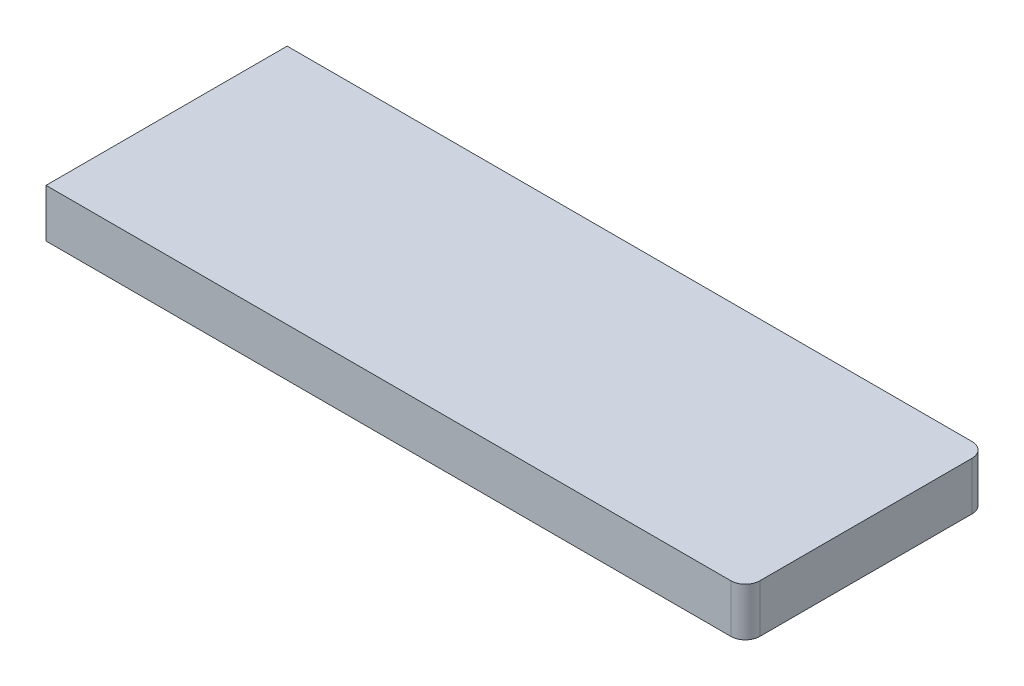
ISO-10303-21;
HEADER;
FILE_DESCRIPTION(('STEP AP214'),'2;1');
FILE_NAME('part.step','',(''),(''),'','','');
FILE_SCHEMA(('AUTOMOTIVE_DESIGN { 1 0 10303 214 1 1 1 1 }'));
ENDSEC;
DATA;
#1=APPLICATION_CONTEXT('core data for automotive mechanical design processes');
#2=APPLICATION_PROTOCOL_DEFINITION('international standard','automotive_design',2000,#1);
#3=PRODUCT_CONTEXT('',#1,'mechanical');
#4=PRODUCT('Part','Part','',(#3));
#5=PRODUCT_RELATED_PRODUCT_CATEGORY('part','',(#4));
#6=PRODUCT_DEFINITION_FORMATION('','',#4);
#7=PRODUCT_DEFINITION_CONTEXT('part definition',#1,'design');
#8=PRODUCT_DEFINITION('design','',#6,#7);
#9=PRODUCT_DEFINITION_SHAPE('','',#8);
#10=(LENGTH_UNIT() NAMED_UNIT(*) SI_UNIT(.MILLI.,.METRE.));
#11=(NAMED_UNIT(*) PLANE_ANGLE_UNIT() SI_UNIT($,.RADIAN.));
#12=(NAMED_UNIT(*) SI_UNIT($,.STERADIAN.) SOLID_ANGLE_UNIT());
#13=UNCERTAINTY_MEASURE_WITH_UNIT(LENGTH_MEASURE(1.E-05),#10,'distance_accuracy_value','');
#14=(GEOMETRIC_REPRESENTATION_CONTEXT(3) GLOBAL_UNCERTAINTY_ASSIGNED_CONTEXT((#13)) GLOBAL_UNIT_ASSIGNED_CONTEXT((#10,
#11,#12)) REPRESENTATION_CONTEXT('',''));
#15=CARTESIAN_POINT('',(0.,0.,0.));
#16=DIRECTION('',(0.,0.,1.));
#17=DIRECTION('',(1.,0.,0.));
#18=AXIS2_PLACEMENT_3D('',#15,#16,#17);
#19=CARTESIAN_POINT('',(72.5,10.,-25.));
#20=DIRECTION('',(-1.,0.,0.));
#21=DIRECTION('',(0.,0.,1.));
#22=AXIS2_PLACEMENT_3D('',#19,#20,#21);
#23=PLANE('',#22);
#24=DIRECTION('',(0.,0.,-1.));
#25=VECTOR('',#24,1.);
#26=CARTESIAN_POINT('',(72.5,0.,-25.));
#27=LINE('',#26,#25);
#28=CARTESIAN_POINT('',(72.5,0.,22.));
#29=VERTEX_POINT('',#28);
#30=CARTESIAN_POINT('',(72.5,0.,-22.));
#31=VERTEX_POINT('',#30);
#32=EDGE_CURVE('E133',#29,#31,#27,.T.);
#33=ORIENTED_EDGE('',*,*,#32,.T.);
#34=DIRECTION('',(0.,-1.,0.));
#35=VECTOR('',#34,1.);
#36=CARTESIAN_POINT('',(72.5,10.,-22.));
#37=LINE('',#36,#35);
#38=CARTESIAN_POINT('',(72.5,10.,-22.));
#39=VERTEX_POINT('',#38);
#40=EDGE_CURVE('E66',#31,#39,#37,.F.);
#41=ORIENTED_EDGE('',*,*,#40,.T.);
#42=DIRECTION('',(0.,0.,-1.));
#43=VECTOR('',#42,1.);
#44=CARTESIAN_POINT('',(72.5,10.,-25.));
#45=LINE('',#44,#43);
#46=CARTESIAN_POINT('',(72.5,10.,22.));
#47=VERTEX_POINT('',#46);
#48=EDGE_CURVE('E111',#47,#39,#45,.T.);
#49=ORIENTED_EDGE('',*,*,#48,.F.);
#50=DIRECTION('',(0.,-1.,0.));
#51=VECTOR('',#50,1.);
#52=CARTESIAN_POINT('',(72.5,10.,22.));
#53=LINE('',#52,#51);
#54=EDGE_CURVE('E147',#47,#29,#53,.T.);
#55=ORIENTED_EDGE('',*,*,#54,.T.);
#56=EDGE_LOOP('',(#33,#41,#49,#55));
#57=FACE_BOUND('',#56,.T.);
#58=ADVANCED_FACE('F45',(#57),#23,.F.);
#59=CARTESIAN_POINT('',(-72.5,10.,-25.));
#60=DIRECTION('',(0.,0.,1.));
#61=DIRECTION('',(1.,0.,0.));
#62=AXIS2_PLACEMENT_3D('',#59,#60,#61);
#63=PLANE('',#62);
#64=DIRECTION('',(-1.,0.,0.));
#65=VECTOR('',#64,1.);
#66=CARTESIAN_POINT('',(-72.5,10.,-25.));
#67=LINE('',#66,#65);
#68=CARTESIAN_POINT('',(69.5,10.,-25.));
#69=VERTEX_POINT('',#68);
#70=CARTESIAN_POINT('',(-72.5,10.,-25.));
#71=VERTEX_POINT('',#70);
#72=EDGE_CURVE('E100',#69,#71,#67,.T.);
#73=ORIENTED_EDGE('',*,*,#72,.F.);
#74=DIRECTION('',(0.,-1.,0.));
#75=VECTOR('',#74,1.);
#76=CARTESIAN_POINT('',(69.5,10.,-25.));
#77=LINE('',#76,#75);
#78=CARTESIAN_POINT('',(69.5,0.,-25.));
#79=VERTEX_POINT('',#78);
#80=EDGE_CURVE('E120',#69,#79,#77,.T.);
#81=ORIENTED_EDGE('',*,*,#80,.T.);
#82=DIRECTION('',(-1.,0.,0.));
#83=VECTOR('',#82,1.);
#84=CARTESIAN_POINT('',(-72.5,0.,-25.));
#85=LINE('',#84,#83);
#86=CARTESIAN_POINT('',(-72.5,0.,-25.));
#87=VERTEX_POINT('',#86);
#88=EDGE_CURVE('E117',#79,#87,#85,.T.);
#89=ORIENTED_EDGE('',*,*,#88,.T.);
#90=DIRECTION('',(0.,-1.,0.));
#91=VECTOR('',#90,1.);
#92=CARTESIAN_POINT('',(-72.5,10.,-25.));
#93=LINE('',#92,#91);
#94=EDGE_CURVE('E114',#71,#87,#93,.T.);
#95=ORIENTED_EDGE('',*,*,#94,.F.);
#96=EDGE_LOOP('',(#73,#81,#89,#95));
#97=FACE_BOUND('',#96,.T.);
#98=ADVANCED_FACE('F115',(#97),#63,.F.);
#99=CARTESIAN_POINT('',(-72.5,10.,-25.));
#100=DIRECTION('',(1.,0.,0.));
#101=DIRECTION('',(0.,0.,-1.));
#102=AXIS2_PLACEMENT_3D('',#99,#100,#101);
#103=PLANE('',#102);
#104=DIRECTION('',(0.,0.,1.));
#105=VECTOR('',#104,1.);
#106=CARTESIAN_POINT('',(-72.5,0.,-25.));
#107=LINE('',#106,#105);
#108=CARTESIAN_POINT('',(-72.5,0.,25.));
#109=VERTEX_POINT('',#108);
#110=EDGE_CURVE('E136',#87,#109,#107,.T.);
#111=ORIENTED_EDGE('',*,*,#110,.T.);
#112=DIRECTION('',(0.,-1.,0.));
#113=VECTOR('',#112,1.);
#114=CARTESIAN_POINT('',(-72.5,10.,25.));
#115=LINE('',#114,#113);
#116=CARTESIAN_POINT('',(-72.5,10.,25.));
#117=VERTEX_POINT('',#116);
#118=EDGE_CURVE('E121',#117,#109,#115,.T.);
#119=ORIENTED_EDGE('',*,*,#118,.F.);
#120=DIRECTION('',(0.,0.,1.));
#121=VECTOR('',#120,1.);
#122=CARTESIAN_POINT('',(-72.5,10.,-25.));
#123=LINE('',#122,#121);
#124=EDGE_CURVE('E104',#71,#117,#123,.T.);
#125=ORIENTED_EDGE('',*,*,#124,.F.);
#126=ORIENTED_EDGE('',*,*,#94,.T.);
#127=EDGE_LOOP('',(#111,#119,#125,#126));
#128=FACE_BOUND('',#127,.T.);
#129=ADVANCED_FACE('F123',(#128),#103,.F.);
#130=CARTESIAN_POINT('',(-72.5,10.,25.));
#131=DIRECTION('',(0.,0.,-1.));
#132=DIRECTION('',(-1.,0.,0.));
#133=AXIS2_PLACEMENT_3D('',#130,#131,#132);
#134=PLANE('',#133);
#135=DIRECTION('',(1.,0.,0.));
#136=VECTOR('',#135,1.);
#137=CARTESIAN_POINT('',(-72.5,0.,25.));
#138=LINE('',#137,#136);
#139=CARTESIAN_POINT('',(69.5,0.,25.));
#140=VERTEX_POINT('',#139);
#141=EDGE_CURVE('E138',#109,#140,#138,.T.);
#142=ORIENTED_EDGE('',*,*,#141,.T.);
#143=DIRECTION('',(0.,-1.,0.));
#144=VECTOR('',#143,1.);
#145=CARTESIAN_POINT('',(69.5,10.,25.));
#146=LINE('',#145,#144);
#147=CARTESIAN_POINT('',(69.5,10.,25.));
#148=VERTEX_POINT('',#147);
#149=EDGE_CURVE('E12',#140,#148,#146,.F.);
#150=ORIENTED_EDGE('',*,*,#149,.T.);
#151=DIRECTION('',(1.,0.,0.));
#152=VECTOR('',#151,1.);
#153=CARTESIAN_POINT('',(-72.5,10.,25.));
#154=LINE('',#153,#152);
#155=EDGE_CURVE('E126',#117,#148,#154,.T.);
#156=ORIENTED_EDGE('',*,*,#155,.F.);
#157=ORIENTED_EDGE('',*,*,#118,.T.);
#158=EDGE_LOOP('',(#142,#150,#156,#157));
#159=FACE_BOUND('',#158,.T.);
#160=ADVANCED_FACE('F163',(#159),#134,.F.);
#161=CARTESIAN_POINT('',(0.,10.,0.));
#162=DIRECTION('',(0.,1.,0.));
#163=DIRECTION('',(0.,0.,1.));
#164=AXIS2_PLACEMENT_3D('',#161,#162,#163);
#165=PLANE('',#164);
#166=ORIENTED_EDGE('',*,*,#48,.T.);
#167=CARTESIAN_POINT('',(69.5,10.,-22.));
#168=DIRECTION('',(0.,1.,0.));
#169=DIRECTION('',(0.,0.,1.));
#170=AXIS2_PLACEMENT_3D('',#167,#168,#169);
#171=CIRCLE('',#170,3.);
#172=EDGE_CURVE('E53',#39,#69,#171,.T.);
#173=ORIENTED_EDGE('',*,*,#172,.T.);
#174=ORIENTED_EDGE('',*,*,#72,.T.);
#175=ORIENTED_EDGE('',*,*,#124,.T.);
#176=ORIENTED_EDGE('',*,*,#155,.T.);
#177=CARTESIAN_POINT('',(69.5,10.,22.));
#178=DIRECTION('',(0.,1.,0.));
#179=DIRECTION('',(0.,0.,1.));
#180=AXIS2_PLACEMENT_3D('',#177,#178,#179);
#181=CIRCLE('',#180,3.);
#182=EDGE_CURVE('E151',#148,#47,#181,.T.);
#183=ORIENTED_EDGE('',*,*,#182,.T.);
#184=EDGE_LOOP('',(#166,#173,#174,#175,#176,#183));
#185=FACE_BOUND('',#184,.T.);
#186=ADVANCED_FACE('F102',(#185),#165,.T.);
#187=CARTESIAN_POINT('',(0.,0.,0.));
#188=DIRECTION('',(0.,1.,0.));
#189=DIRECTION('',(0.,0.,1.));
#190=AXIS2_PLACEMENT_3D('',#187,#188,#189);
#191=PLANE('',#190);
#192=ORIENTED_EDGE('',*,*,#88,.F.);
#193=CARTESIAN_POINT('',(69.5,0.,-22.));
#194=DIRECTION('',(0.,1.,0.));
#195=DIRECTION('',(0.,0.,1.));
#196=AXIS2_PLACEMENT_3D('',#193,#194,#195);
#197=CIRCLE('',#196,3.);
#198=EDGE_CURVE('E145',#79,#31,#197,.F.);
#199=ORIENTED_EDGE('',*,*,#198,.T.);
#200=ORIENTED_EDGE('',*,*,#32,.F.);
#201=CARTESIAN_POINT('',(69.5,0.,22.));
#202=DIRECTION('',(0.,1.,0.));
#203=DIRECTION('',(0.,0.,1.));
#204=AXIS2_PLACEMENT_3D('',#201,#202,#203);
#205=CIRCLE('',#204,3.);
#206=EDGE_CURVE('E143',#29,#140,#205,.F.);
#207=ORIENTED_EDGE('',*,*,#206,.T.);
#208=ORIENTED_EDGE('',*,*,#141,.F.);
#209=ORIENTED_EDGE('',*,*,#110,.F.);
#210=EDGE_LOOP('',(#192,#199,#200,#207,#208,#209));
#211=FACE_BOUND('',#210,.T.);
#212=ADVANCED_FACE('F160',(#211),#191,.F.);
#213=CARTESIAN_POINT('',(69.5,10.,-22.));
#214=DIRECTION('',(0.,-1.,0.));
#215=DIRECTION('',(0.,0.,-1.));
#216=AXIS2_PLACEMENT_3D('',#213,#214,#215);
#217=CYLINDRICAL_SURFACE('',#216,3.);
#218=ORIENTED_EDGE('',*,*,#172,.F.);
#219=ORIENTED_EDGE('',*,*,#40,.F.);
#220=ORIENTED_EDGE('',*,*,#198,.F.);
#221=ORIENTED_EDGE('',*,*,#80,.F.);
#222=EDGE_LOOP('',(#218,#219,#220,#221));
#223=FACE_BOUND('',#222,.T.);
#224=ADVANCED_FACE('F158',(#223),#217,.T.);
#225=CARTESIAN_POINT('',(69.5,10.,22.));
#226=DIRECTION('',(0.,-1.,0.));
#227=DIRECTION('',(0.,0.,-1.));
#228=AXIS2_PLACEMENT_3D('',#225,#226,#227);
#229=CYLINDRICAL_SURFACE('',#228,3.);
#230=ORIENTED_EDGE('',*,*,#182,.F.);
#231=ORIENTED_EDGE('',*,*,#149,.F.);
#232=ORIENTED_EDGE('',*,*,#206,.F.);
#233=ORIENTED_EDGE('',*,*,#54,.F.);
#234=EDGE_LOOP('',(#230,#231,#232,#233));
#235=FACE_BOUND('',#234,.T.);
#236=ADVANCED_FACE('F47',(#235),#229,.T.);
#237=CLOSED_SHELL('',(#58,#98,#129,#160,#186,#212,#224,#236));
#238=MANIFOLD_SOLID_BREP('B2',#237);
#239=ADVANCED_BREP_SHAPE_REPRESENTATION('',(#18,#238),#14);
#240=SHAPE_DEFINITION_REPRESENTATION(#9,#239);
ENDSEC;
END-ISO-10303-21;
